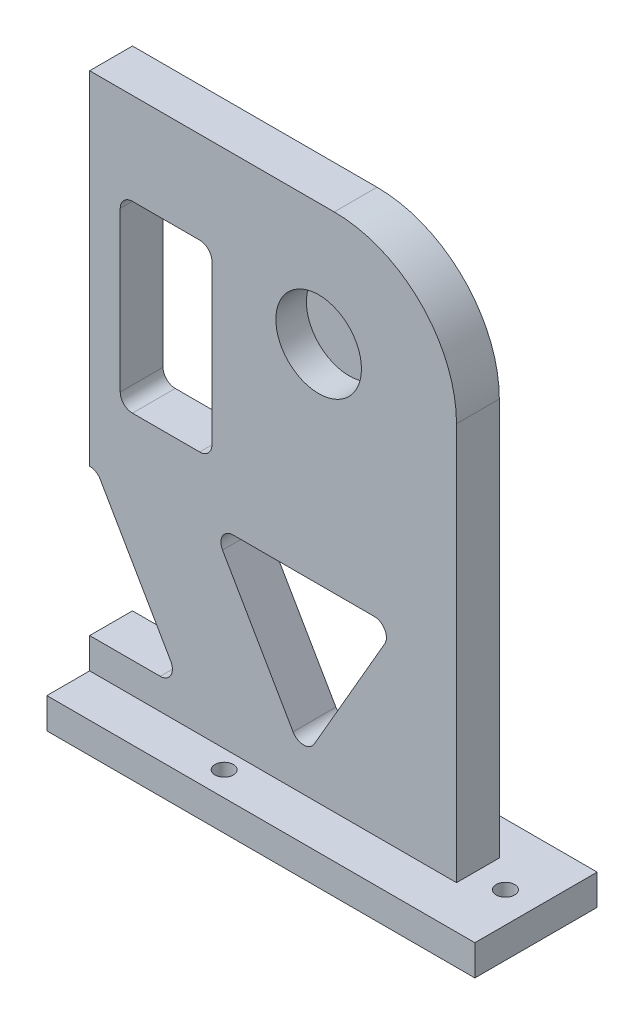
ISO-10303-21;
HEADER;
FILE_DESCRIPTION(('STEP AP214'),'2;1');
FILE_NAME('part.step','',(''),(''),'','','');
FILE_SCHEMA(('AUTOMOTIVE_DESIGN { 1 0 10303 214 1 1 1 1 }'));
ENDSEC;
DATA;
#1=APPLICATION_CONTEXT('core data for automotive mechanical design processes');
#2=APPLICATION_PROTOCOL_DEFINITION('international standard','automotive_design',2000,#1);
#3=PRODUCT_CONTEXT('',#1,'mechanical');
#4=PRODUCT('Part','Part','',(#3));
#5=PRODUCT_RELATED_PRODUCT_CATEGORY('part','',(#4));
#6=PRODUCT_DEFINITION_FORMATION('','',#4);
#7=PRODUCT_DEFINITION_CONTEXT('part definition',#1,'design');
#8=PRODUCT_DEFINITION('design','',#6,#7);
#9=PRODUCT_DEFINITION_SHAPE('','',#8);
#10=(LENGTH_UNIT() NAMED_UNIT(*) SI_UNIT(.MILLI.,.METRE.));
#11=(NAMED_UNIT(*) PLANE_ANGLE_UNIT() SI_UNIT($,.RADIAN.));
#12=(NAMED_UNIT(*) SI_UNIT($,.STERADIAN.) SOLID_ANGLE_UNIT());
#13=UNCERTAINTY_MEASURE_WITH_UNIT(LENGTH_MEASURE(1.E-05),#10,'distance_accuracy_value','');
#14=(GEOMETRIC_REPRESENTATION_CONTEXT(3) GLOBAL_UNCERTAINTY_ASSIGNED_CONTEXT((#13)) GLOBAL_UNIT_ASSIGNED_CONTEXT((#10,
#11,#12)) REPRESENTATION_CONTEXT('',''));
#15=CARTESIAN_POINT('',(0.,0.,0.));
#16=DIRECTION('',(0.,0.,1.));
#17=DIRECTION('',(1.,0.,0.));
#18=AXIS2_PLACEMENT_3D('',#15,#16,#17);
#19=CARTESIAN_POINT('',(70.,0.,0.));
#20=DIRECTION('',(1.,0.,0.));
#21=DIRECTION('',(0.,0.,-1.));
#22=AXIS2_PLACEMENT_3D('',#19,#20,#21);
#23=PLANE('',#22);
#24=DIRECTION('',(0.,1.,0.));
#25=VECTOR('',#24,1.);
#26=CARTESIAN_POINT('',(70.,5.,14.));
#27=LINE('',#26,#25);
#28=CARTESIAN_POINT('',(70.,0.,14.));
#29=VERTEX_POINT('',#28);
#30=CARTESIAN_POINT('',(70.,5.,14.));
#31=VERTEX_POINT('',#30);
#32=EDGE_CURVE('E48',#29,#31,#27,.T.);
#33=ORIENTED_EDGE('',*,*,#32,.T.);
#34=DIRECTION('',(0.,0.,1.));
#35=VECTOR('',#34,1.);
#36=CARTESIAN_POINT('',(70.,5.,0.));
#37=LINE('',#36,#35);
#38=CARTESIAN_POINT('',(70.,5.,7.));
#39=VERTEX_POINT('',#38);
#40=EDGE_CURVE('E396',#39,#31,#37,.T.);
#41=ORIENTED_EDGE('',*,*,#40,.F.);
#42=DIRECTION('',(0.,1.,0.));
#43=VECTOR('',#42,1.);
#44=CARTESIAN_POINT('',(70.,0.,7.));
#45=LINE('',#44,#43);
#46=CARTESIAN_POINT('',(70.,10.,7.));
#47=VERTEX_POINT('',#46);
#48=EDGE_CURVE('E389',#39,#47,#45,.T.);
#49=ORIENTED_EDGE('',*,*,#48,.T.);
#50=DIRECTION('',(0.,0.,1.));
#51=VECTOR('',#50,1.);
#52=CARTESIAN_POINT('',(70.,10.,-6.00100000000002));
#53=LINE('',#52,#51);
#54=CARTESIAN_POINT('',(70.,10.,0.));
#55=VERTEX_POINT('',#54);
#56=EDGE_CURVE('E386',#55,#47,#53,.T.);
#57=ORIENTED_EDGE('',*,*,#56,.F.);
#58=DIRECTION('',(0.,1.,0.));
#59=VECTOR('',#58,1.);
#60=CARTESIAN_POINT('',(70.,0.,0.));
#61=LINE('',#60,#59);
#62=CARTESIAN_POINT('',(70.,5.,0.));
#63=VERTEX_POINT('',#62);
#64=EDGE_CURVE('E387',#63,#55,#61,.T.);
#65=ORIENTED_EDGE('',*,*,#64,.F.);
#66=CARTESIAN_POINT('',(70.,5.,-6.00000000000002));
#67=VERTEX_POINT('',#66);
#68=EDGE_CURVE('E394',#67,#63,#37,.T.);
#69=ORIENTED_EDGE('',*,*,#68,.F.);
#70=DIRECTION('',(0.,-1.,0.));
#71=VECTOR('',#70,1.);
#72=CARTESIAN_POINT('',(70.,5.,-6.00000000000002));
#73=LINE('',#72,#71);
#74=CARTESIAN_POINT('',(70.,0.,-6.00000000000002));
#75=VERTEX_POINT('',#74);
#76=EDGE_CURVE('E11',#67,#75,#73,.T.);
#77=ORIENTED_EDGE('',*,*,#76,.T.);
#78=DIRECTION('',(0.,0.,-1.));
#79=VECTOR('',#78,1.);
#80=CARTESIAN_POINT('',(70.,0.,7.));
#81=LINE('',#80,#79);
#82=EDGE_CURVE('E43',#29,#75,#81,.T.);
#83=ORIENTED_EDGE('',*,*,#82,.F.);
#84=EDGE_LOOP('',(#33,#41,#49,#57,#65,#69,#77,#83));
#85=FACE_BOUND('',#84,.T.);
#86=ADVANCED_FACE('F40',(#85),#23,.F.);
#87=CARTESIAN_POINT('',(70.,33.9807621135332,0.));
#88=VERTEX_POINT('',#87);
#89=CARTESIAN_POINT('',(70.,90.,0.));
#90=VERTEX_POINT('',#89);
#91=EDGE_CURVE('E390',#88,#90,#61,.T.);
#92=ORIENTED_EDGE('',*,*,#91,.F.);
#93=DIRECTION('',(0.,0.,-1.));
#94=VECTOR('',#93,1.);
#95=CARTESIAN_POINT('',(70.,33.9807621135332,-6.00100000000002));
#96=LINE('',#95,#94);
#97=CARTESIAN_POINT('',(70.,33.9807621135332,7.));
#98=VERTEX_POINT('',#97);
#99=EDGE_CURVE('E384',#98,#88,#96,.T.);
#100=ORIENTED_EDGE('',*,*,#99,.F.);
#101=CARTESIAN_POINT('',(70.,90.,7.));
#102=VERTEX_POINT('',#101);
#103=EDGE_CURVE('E391',#98,#102,#45,.T.);
#104=ORIENTED_EDGE('',*,*,#103,.T.);
#105=DIRECTION('',(0.,0.,1.));
#106=VECTOR('',#105,1.);
#107=CARTESIAN_POINT('',(70.,90.,7.));
#108=LINE('',#107,#106);
#109=EDGE_CURVE('E56',#90,#102,#108,.T.);
#110=ORIENTED_EDGE('',*,*,#109,.F.);
#111=EDGE_LOOP('',(#92,#100,#104,#110));
#112=FACE_BOUND('',#111,.T.);
#113=ADVANCED_FACE('F527',(#112),#23,.F.);
#114=CARTESIAN_POINT('',(107.451775515975,69.9999999999981,2.));
#115=DIRECTION('',(0.,0.,1.));
#116=DIRECTION('',(1.,0.,0.));
#117=AXIS2_PLACEMENT_3D('',#114,#115,#116);
#118=PLANE('',#117);
#119=CARTESIAN_POINT('',(107.451775515975,69.9999999999981,2.));
#120=DIRECTION('',(0.,0.,1.));
#121=DIRECTION('',(1.,0.,0.));
#122=AXIS2_PLACEMENT_3D('',#119,#120,#121);
#123=CIRCLE('',#122,7.);
#124=CARTESIAN_POINT('',(114.451775515975,69.9999999999981,2.));
#125=VERTEX_POINT('',#124);
#126=EDGE_CURVE('E264',#125,#125,#123,.T.);
#127=ORIENTED_EDGE('',*,*,#126,.T.);
#128=EDGE_LOOP('',(#127));
#129=FACE_BOUND('',#128,.T.);
#130=ADVANCED_FACE('F517',(#129),#118,.T.);
#131=CARTESIAN_POINT('',(107.451775515975,69.9999999999981,2.));
#132=DIRECTION('',(0.,0.,1.));
#133=DIRECTION('',(1.,0.,0.));
#134=AXIS2_PLACEMENT_3D('',#131,#132,#133);
#135=CYLINDRICAL_SURFACE('',#134,7.);
#136=ORIENTED_EDGE('',*,*,#126,.F.);
#137=EDGE_LOOP('',(#136));
#138=FACE_BOUND('',#137,.T.);
#139=CARTESIAN_POINT('',(107.451775515975,69.9999999999981,7.));
#140=DIRECTION('',(0.,0.,1.));
#141=DIRECTION('',(1.,0.,0.));
#142=AXIS2_PLACEMENT_3D('',#139,#140,#141);
#143=CIRCLE('',#142,7.);
#144=CARTESIAN_POINT('',(114.451775515975,69.9999999999981,7.));
#145=VERTEX_POINT('',#144);
#146=EDGE_CURVE('E265',#145,#145,#143,.T.);
#147=ORIENTED_EDGE('',*,*,#146,.T.);
#148=EDGE_LOOP('',(#147));
#149=FACE_BOUND('',#148,.T.);
#150=ADVANCED_FACE('F514',(#138,#149),#135,.F.);
#151=CARTESIAN_POINT('',(116.535898384862,33.9807621135332,-6.00100000000002));
#152=DIRECTION('',(0.,0.,-1.));
#153=DIRECTION('',(-1.,0.,0.));
#154=AXIS2_PLACEMENT_3D('',#151,#152,#153);
#155=CYLINDRICAL_SURFACE('',#154,2.);
#156=CARTESIAN_POINT('',(116.535898384862,33.9807621135332,0.));
#157=DIRECTION('',(0.,0.,1.));
#158=DIRECTION('',(1.,0.,0.));
#159=AXIS2_PLACEMENT_3D('',#156,#157,#158);
#160=CIRCLE('',#159,2.);
#161=CARTESIAN_POINT('',(118.267949192431,32.9807621135332,0.));
#162=VERTEX_POINT('',#161);
#163=CARTESIAN_POINT('',(116.535898384862,35.9807621135332,0.));
#164=VERTEX_POINT('',#163);
#165=EDGE_CURVE('E320',#162,#164,#160,.T.);
#166=ORIENTED_EDGE('',*,*,#165,.F.);
#167=DIRECTION('',(0.,0.,1.));
#168=VECTOR('',#167,1.);
#169=CARTESIAN_POINT('',(118.267949192431,32.9807621135332,0.));
#170=LINE('',#169,#168);
#171=CARTESIAN_POINT('',(118.267949192431,32.9807621135332,7.));
#172=VERTEX_POINT('',#171);
#173=EDGE_CURVE('E305',#172,#162,#170,.F.);
#174=ORIENTED_EDGE('',*,*,#173,.F.);
#175=CARTESIAN_POINT('',(116.535898384862,33.9807621135332,7.));
#176=DIRECTION('',(0.,0.,1.));
#177=DIRECTION('',(1.,0.,0.));
#178=AXIS2_PLACEMENT_3D('',#175,#176,#177);
#179=CIRCLE('',#178,2.);
#180=CARTESIAN_POINT('',(116.535898384862,35.9807621135332,7.));
#181=VERTEX_POINT('',#180);
#182=EDGE_CURVE('E318',#181,#172,#179,.F.);
#183=ORIENTED_EDGE('',*,*,#182,.F.);
#184=DIRECTION('',(0.,0.,1.));
#185=VECTOR('',#184,1.);
#186=CARTESIAN_POINT('',(116.535898384862,35.9807621135332,7.));
#187=LINE('',#186,#185);
#188=EDGE_CURVE('E297',#164,#181,#187,.T.);
#189=ORIENTED_EDGE('',*,*,#188,.F.);
#190=EDGE_LOOP('',(#166,#174,#183,#189));
#191=FACE_BOUND('',#190,.T.);
#192=ADVANCED_FACE('F516',(#191),#155,.F.);
#193=CARTESIAN_POINT('',(120.,35.9807621135332,-6.00100000000002));
#194=DIRECTION('',(0.866025403784438,-0.5,0.));
#195=DIRECTION('',(0.5,0.866025403784439,0.));
#196=AXIS2_PLACEMENT_3D('',#193,#194,#195);
#197=PLANE('',#196);
#198=DIRECTION('',(0.5,0.866025403784439,0.));
#199=VECTOR('',#198,1.);
#200=CARTESIAN_POINT('',(120.,35.9807621135332,7.));
#201=LINE('',#200,#199);
#202=CARTESIAN_POINT('',(106.732050807569,13.,7.));
#203=VERTEX_POINT('',#202);
#204=EDGE_CURVE('E435',#203,#172,#201,.T.);
#205=ORIENTED_EDGE('',*,*,#204,.T.);
#206=ORIENTED_EDGE('',*,*,#173,.T.);
#207=DIRECTION('',(-0.5,-0.866025403784439,0.));
#208=VECTOR('',#207,1.);
#209=CARTESIAN_POINT('',(120.,35.9807621135332,0.));
#210=LINE('',#209,#208);
#211=CARTESIAN_POINT('',(106.732050807569,13.,0.));
#212=VERTEX_POINT('',#211);
#213=EDGE_CURVE('E441',#162,#212,#210,.T.);
#214=ORIENTED_EDGE('',*,*,#213,.T.);
#215=DIRECTION('',(0.,0.,1.));
#216=VECTOR('',#215,1.);
#217=CARTESIAN_POINT('',(106.732050807569,13.,7.));
#218=LINE('',#217,#216);
#219=EDGE_CURVE('E302',#212,#203,#218,.T.);
#220=ORIENTED_EDGE('',*,*,#219,.T.);
#221=EDGE_LOOP('',(#205,#206,#214,#220));
#222=FACE_BOUND('',#221,.T.);
#223=ADVANCED_FACE('F524',(#222),#197,.F.);
#224=CARTESIAN_POINT('',(105.,14.,-6.00100000000002));
#225=DIRECTION('',(0.,0.,-1.));
#226=DIRECTION('',(-1.,0.,0.));
#227=AXIS2_PLACEMENT_3D('',#224,#225,#226);
#228=CYLINDRICAL_SURFACE('',#227,2.);
#229=CARTESIAN_POINT('',(105.,14.,0.));
#230=DIRECTION('',(0.,0.,1.));
#231=DIRECTION('',(1.,0.,0.));
#232=AXIS2_PLACEMENT_3D('',#229,#230,#231);
#233=CIRCLE('',#232,2.);
#234=CARTESIAN_POINT('',(103.267949192431,13.,0.));
#235=VERTEX_POINT('',#234);
#236=EDGE_CURVE('E324',#235,#212,#233,.T.);
#237=ORIENTED_EDGE('',*,*,#236,.F.);
#238=DIRECTION('',(0.,0.,1.));
#239=VECTOR('',#238,1.);
#240=CARTESIAN_POINT('',(103.267949192431,13.,0.));
#241=LINE('',#240,#239);
#242=CARTESIAN_POINT('',(103.267949192431,13.,7.));
#243=VERTEX_POINT('',#242);
#244=EDGE_CURVE('E292',#243,#235,#241,.F.);
#245=ORIENTED_EDGE('',*,*,#244,.F.);
#246=CARTESIAN_POINT('',(105.,14.,7.));
#247=DIRECTION('',(0.,0.,1.));
#248=DIRECTION('',(1.,0.,0.));
#249=AXIS2_PLACEMENT_3D('',#246,#247,#248);
#250=CIRCLE('',#249,2.);
#251=EDGE_CURVE('E322',#203,#243,#250,.F.);
#252=ORIENTED_EDGE('',*,*,#251,.F.);
#253=ORIENTED_EDGE('',*,*,#219,.F.);
#254=EDGE_LOOP('',(#237,#245,#252,#253));
#255=FACE_BOUND('',#254,.T.);
#256=ADVANCED_FACE('F568',(#255),#228,.F.);
#257=CARTESIAN_POINT('',(105.,10.,-6.00100000000002));
#258=DIRECTION('',(-0.866025403784438,-0.5,0.));
#259=DIRECTION('',(0.5,-0.866025403784439,0.));
#260=AXIS2_PLACEMENT_3D('',#257,#258,#259);
#261=PLANE('',#260);
#262=DIRECTION('',(-0.5,0.866025403784439,0.));
#263=VECTOR('',#262,1.);
#264=CARTESIAN_POINT('',(105.,10.,0.));
#265=LINE('',#264,#263);
#266=CARTESIAN_POINT('',(91.7320508075689,32.9807621135332,0.));
#267=VERTEX_POINT('',#266);
#268=EDGE_CURVE('E429',#235,#267,#265,.T.);
#269=ORIENTED_EDGE('',*,*,#268,.T.);
#270=DIRECTION('',(0.,0.,1.));
#271=VECTOR('',#270,1.);
#272=CARTESIAN_POINT('',(91.7320508075689,32.9807621135332,7.));
#273=LINE('',#272,#271);
#274=CARTESIAN_POINT('',(91.7320508075689,32.9807621135332,7.));
#275=VERTEX_POINT('',#274);
#276=EDGE_CURVE('E294',#267,#275,#273,.T.);
#277=ORIENTED_EDGE('',*,*,#276,.T.);
#278=DIRECTION('',(0.5,-0.866025403784439,0.));
#279=VECTOR('',#278,1.);
#280=CARTESIAN_POINT('',(105.,10.,7.));
#281=LINE('',#280,#279);
#282=EDGE_CURVE('E432',#275,#243,#281,.T.);
#283=ORIENTED_EDGE('',*,*,#282,.T.);
#284=ORIENTED_EDGE('',*,*,#244,.T.);
#285=EDGE_LOOP('',(#269,#277,#283,#284));
#286=FACE_BOUND('',#285,.T.);
#287=ADVANCED_FACE('F565',(#286),#261,.F.);
#288=CARTESIAN_POINT('',(93.4641016151378,33.9807621135332,-6.00100000000002));
#289=DIRECTION('',(0.,0.,-1.));
#290=DIRECTION('',(-1.,0.,0.));
#291=AXIS2_PLACEMENT_3D('',#288,#289,#290);
#292=CYLINDRICAL_SURFACE('',#291,2.);
#293=CARTESIAN_POINT('',(93.4641016151378,33.9807621135332,0.));
#294=DIRECTION('',(0.,0.,1.));
#295=DIRECTION('',(1.,0.,0.));
#296=AXIS2_PLACEMENT_3D('',#293,#294,#295);
#297=CIRCLE('',#296,2.);
#298=CARTESIAN_POINT('',(93.4641016151378,35.9807621135332,0.));
#299=VERTEX_POINT('',#298);
#300=EDGE_CURVE('E316',#299,#267,#297,.T.);
#301=ORIENTED_EDGE('',*,*,#300,.F.);
#302=DIRECTION('',(0.,0.,1.));
#303=VECTOR('',#302,1.);
#304=CARTESIAN_POINT('',(93.4641016151378,35.9807621135332,0.));
#305=LINE('',#304,#303);
#306=CARTESIAN_POINT('',(93.4641016151378,35.9807621135332,7.));
#307=VERTEX_POINT('',#306);
#308=EDGE_CURVE('E300',#307,#299,#305,.F.);
#309=ORIENTED_EDGE('',*,*,#308,.F.);
#310=CARTESIAN_POINT('',(93.4641016151378,33.9807621135332,7.));
#311=DIRECTION('',(0.,0.,1.));
#312=DIRECTION('',(1.,0.,0.));
#313=AXIS2_PLACEMENT_3D('',#310,#311,#312);
#314=CIRCLE('',#313,2.);
#315=EDGE_CURVE('E314',#275,#307,#314,.F.);
#316=ORIENTED_EDGE('',*,*,#315,.F.);
#317=ORIENTED_EDGE('',*,*,#276,.F.);
#318=EDGE_LOOP('',(#301,#309,#316,#317));
#319=FACE_BOUND('',#318,.T.);
#320=ADVANCED_FACE('F562',(#319),#292,.F.);
#321=CARTESIAN_POINT('',(90.,35.9807621135332,-6.00100000000002));
#322=DIRECTION('',(0.,1.,0.));
#323=DIRECTION('',(0.,0.,1.));
#324=AXIS2_PLACEMENT_3D('',#321,#322,#323);
#325=PLANE('',#324);
#326=DIRECTION('',(-1.,0.,0.));
#327=VECTOR('',#326,1.);
#328=CARTESIAN_POINT('',(90.,35.9807621135332,7.));
#329=LINE('',#328,#327);
#330=EDGE_CURVE('E438',#181,#307,#329,.T.);
#331=ORIENTED_EDGE('',*,*,#330,.T.);
#332=ORIENTED_EDGE('',*,*,#308,.T.);
#333=DIRECTION('',(1.,0.,0.));
#334=VECTOR('',#333,1.);
#335=CARTESIAN_POINT('',(90.,35.9807621135332,0.));
#336=LINE('',#335,#334);
#337=EDGE_CURVE('E425',#299,#164,#336,.T.);
#338=ORIENTED_EDGE('',*,*,#337,.T.);
#339=ORIENTED_EDGE('',*,*,#188,.T.);
#340=EDGE_LOOP('',(#331,#332,#338,#339));
#341=FACE_BOUND('',#340,.T.);
#342=ADVANCED_FACE('F564',(#341),#325,.F.);
#343=CARTESIAN_POINT('',(88.,47.,-6.00000000000002));
#344=DIRECTION('',(0.,0.,-1.));
#345=DIRECTION('',(-1.,0.,0.));
#346=AXIS2_PLACEMENT_3D('',#343,#344,#345);
#347=CYLINDRICAL_SURFACE('',#346,2.);
#348=CARTESIAN_POINT('',(88.,47.,0.));
#349=DIRECTION('',(0.,0.,1.));
#350=DIRECTION('',(1.,0.,0.));
#351=AXIS2_PLACEMENT_3D('',#348,#349,#350);
#352=CIRCLE('',#351,2.);
#353=CARTESIAN_POINT('',(88.,45.,0.));
#354=VERTEX_POINT('',#353);
#355=CARTESIAN_POINT('',(90.,47.,0.));
#356=VERTEX_POINT('',#355);
#357=EDGE_CURVE('E374',#354,#356,#352,.T.);
#358=ORIENTED_EDGE('',*,*,#357,.F.);
#359=DIRECTION('',(0.,0.,1.));
#360=VECTOR('',#359,1.);
#361=CARTESIAN_POINT('',(88.,45.,0.));
#362=LINE('',#361,#360);
#363=CARTESIAN_POINT('',(88.,45.,7.));
#364=VERTEX_POINT('',#363);
#365=EDGE_CURVE('E348',#364,#354,#362,.F.);
#366=ORIENTED_EDGE('',*,*,#365,.F.);
#367=CARTESIAN_POINT('',(88.,47.,7.));
#368=DIRECTION('',(0.,0.,1.));
#369=DIRECTION('',(1.,0.,0.));
#370=AXIS2_PLACEMENT_3D('',#367,#368,#369);
#371=CIRCLE('',#370,2.);
#372=CARTESIAN_POINT('',(90.,47.,7.));
#373=VERTEX_POINT('',#372);
#374=EDGE_CURVE('E372',#373,#364,#371,.F.);
#375=ORIENTED_EDGE('',*,*,#374,.F.);
#376=DIRECTION('',(0.,0.,1.));
#377=VECTOR('',#376,1.);
#378=CARTESIAN_POINT('',(90.,47.,7.));
#379=LINE('',#378,#377);
#380=EDGE_CURVE('E360',#356,#373,#379,.T.);
#381=ORIENTED_EDGE('',*,*,#380,.F.);
#382=EDGE_LOOP('',(#358,#366,#375,#381));
#383=FACE_BOUND('',#382,.T.);
#384=ADVANCED_FACE('F485',(#383),#347,.F.);
#385=CARTESIAN_POINT('',(75.,45.,-6.00000000000002));
#386=DIRECTION('',(0.,-1.,0.));
#387=DIRECTION('',(0.,0.,-1.));
#388=AXIS2_PLACEMENT_3D('',#385,#386,#387);
#389=PLANE('',#388);
#390=DIRECTION('',(1.,0.,0.));
#391=VECTOR('',#390,1.);
#392=CARTESIAN_POINT('',(0.,45.,0.));
#393=LINE('',#392,#391);
#394=CARTESIAN_POINT('',(77.,45.,0.));
#395=VERTEX_POINT('',#394);
#396=EDGE_CURVE('E336',#395,#354,#393,.T.);
#397=ORIENTED_EDGE('',*,*,#396,.F.);
#398=DIRECTION('',(0.,0.,1.));
#399=VECTOR('',#398,1.);
#400=CARTESIAN_POINT('',(77.,45.,7.));
#401=LINE('',#400,#399);
#402=CARTESIAN_POINT('',(77.,45.,7.));
#403=VERTEX_POINT('',#402);
#404=EDGE_CURVE('E350',#395,#403,#401,.T.);
#405=ORIENTED_EDGE('',*,*,#404,.T.);
#406=DIRECTION('',(1.,0.,0.));
#407=VECTOR('',#406,1.);
#408=CARTESIAN_POINT('',(75.,45.,7.));
#409=LINE('',#408,#407);
#410=EDGE_CURVE('E459',#403,#364,#409,.T.);
#411=ORIENTED_EDGE('',*,*,#410,.T.);
#412=ORIENTED_EDGE('',*,*,#365,.T.);
#413=EDGE_LOOP('',(#397,#405,#411,#412));
#414=FACE_BOUND('',#413,.T.);
#415=ADVANCED_FACE('F481',(#414),#389,.F.);
#416=CARTESIAN_POINT('',(77.,47.,-6.00000000000002));
#417=DIRECTION('',(0.,0.,-1.));
#418=DIRECTION('',(-1.,0.,0.));
#419=AXIS2_PLACEMENT_3D('',#416,#417,#418);
#420=CYLINDRICAL_SURFACE('',#419,2.);
#421=CARTESIAN_POINT('',(77.,47.,0.));
#422=DIRECTION('',(0.,0.,1.));
#423=DIRECTION('',(1.,0.,0.));
#424=AXIS2_PLACEMENT_3D('',#421,#422,#423);
#425=CIRCLE('',#424,2.);
#426=CARTESIAN_POINT('',(75.,47.,0.));
#427=VERTEX_POINT('',#426);
#428=EDGE_CURVE('E370',#427,#395,#425,.T.);
#429=ORIENTED_EDGE('',*,*,#428,.F.);
#430=DIRECTION('',(0.,0.,1.));
#431=VECTOR('',#430,1.);
#432=CARTESIAN_POINT('',(75.,47.,0.));
#433=LINE('',#432,#431);
#434=CARTESIAN_POINT('',(75.,47.,7.));
#435=VERTEX_POINT('',#434);
#436=EDGE_CURVE('E356',#435,#427,#433,.F.);
#437=ORIENTED_EDGE('',*,*,#436,.F.);
#438=CARTESIAN_POINT('',(77.,47.,7.));
#439=DIRECTION('',(0.,0.,1.));
#440=DIRECTION('',(1.,0.,0.));
#441=AXIS2_PLACEMENT_3D('',#438,#439,#440);
#442=CIRCLE('',#441,2.);
#443=EDGE_CURVE('E368',#403,#435,#442,.F.);
#444=ORIENTED_EDGE('',*,*,#443,.F.);
#445=ORIENTED_EDGE('',*,*,#404,.F.);
#446=EDGE_LOOP('',(#429,#437,#444,#445));
#447=FACE_BOUND('',#446,.T.);
#448=ADVANCED_FACE('F473',(#447),#420,.F.);
#449=CARTESIAN_POINT('',(75.,45.,-6.00000000000002));
#450=DIRECTION('',(-1.,0.,0.));
#451=DIRECTION('',(0.,0.,1.));
#452=AXIS2_PLACEMENT_3D('',#449,#450,#451);
#453=PLANE('',#452);
#454=DIRECTION('',(0.,-1.,0.));
#455=VECTOR('',#454,1.);
#456=CARTESIAN_POINT('',(75.,45.,7.));
#457=LINE('',#456,#455);
#458=CARTESIAN_POINT('',(75.,73.,7.));
#459=VERTEX_POINT('',#458);
#460=EDGE_CURVE('E462',#459,#435,#457,.T.);
#461=ORIENTED_EDGE('',*,*,#460,.T.);
#462=ORIENTED_EDGE('',*,*,#436,.T.);
#463=DIRECTION('',(0.,-1.,0.));
#464=VECTOR('',#463,1.);
#465=CARTESIAN_POINT('',(75.,0.,0.));
#466=LINE('',#465,#464);
#467=CARTESIAN_POINT('',(75.,73.,0.));
#468=VERTEX_POINT('',#467);
#469=EDGE_CURVE('E345',#468,#427,#466,.T.);
#470=ORIENTED_EDGE('',*,*,#469,.F.);
#471=DIRECTION('',(0.,0.,1.));
#472=VECTOR('',#471,1.);
#473=CARTESIAN_POINT('',(75.,73.,7.));
#474=LINE('',#473,#472);
#475=EDGE_CURVE('E353',#468,#459,#474,.T.);
#476=ORIENTED_EDGE('',*,*,#475,.T.);
#477=EDGE_LOOP('',(#461,#462,#470,#476));
#478=FACE_BOUND('',#477,.T.);
#479=ADVANCED_FACE('F467',(#478),#453,.F.);
#480=CARTESIAN_POINT('',(77.,73.,-6.00000000000002));
#481=DIRECTION('',(0.,0.,-1.));
#482=DIRECTION('',(-1.,0.,0.));
#483=AXIS2_PLACEMENT_3D('',#480,#481,#482);
#484=CYLINDRICAL_SURFACE('',#483,2.);
#485=CARTESIAN_POINT('',(77.,73.,0.));
#486=DIRECTION('',(0.,0.,1.));
#487=DIRECTION('',(1.,0.,0.));
#488=AXIS2_PLACEMENT_3D('',#485,#486,#487);
#489=CIRCLE('',#488,2.);
#490=CARTESIAN_POINT('',(77.,75.,0.));
#491=VERTEX_POINT('',#490);
#492=EDGE_CURVE('E378',#491,#468,#489,.T.);
#493=ORIENTED_EDGE('',*,*,#492,.F.);
#494=DIRECTION('',(0.,0.,1.));
#495=VECTOR('',#494,1.);
#496=CARTESIAN_POINT('',(77.,75.,0.));
#497=LINE('',#496,#495);
#498=CARTESIAN_POINT('',(77.,75.,7.));
#499=VERTEX_POINT('',#498);
#500=EDGE_CURVE('E366',#499,#491,#497,.F.);
#501=ORIENTED_EDGE('',*,*,#500,.F.);
#502=CARTESIAN_POINT('',(77.,73.,7.));
#503=DIRECTION('',(0.,0.,1.));
#504=DIRECTION('',(1.,0.,0.));
#505=AXIS2_PLACEMENT_3D('',#502,#503,#504);
#506=CIRCLE('',#505,2.);
#507=EDGE_CURVE('E376',#459,#499,#506,.F.);
#508=ORIENTED_EDGE('',*,*,#507,.F.);
#509=ORIENTED_EDGE('',*,*,#475,.F.);
#510=EDGE_LOOP('',(#493,#501,#508,#509));
#511=FACE_BOUND('',#510,.T.);
#512=ADVANCED_FACE('F503',(#511),#484,.F.);
#513=CARTESIAN_POINT('',(75.,75.,-6.00000000000002));
#514=DIRECTION('',(0.,1.,0.));
#515=DIRECTION('',(0.,0.,1.));
#516=AXIS2_PLACEMENT_3D('',#513,#514,#515);
#517=PLANE('',#516);
#518=DIRECTION('',(-1.,0.,0.));
#519=VECTOR('',#518,1.);
#520=CARTESIAN_POINT('',(75.,75.,7.));
#521=LINE('',#520,#519);
#522=CARTESIAN_POINT('',(88.,75.,7.));
#523=VERTEX_POINT('',#522);
#524=EDGE_CURVE('E444',#523,#499,#521,.T.);
#525=ORIENTED_EDGE('',*,*,#524,.T.);
#526=ORIENTED_EDGE('',*,*,#500,.T.);
#527=DIRECTION('',(-1.,0.,0.));
#528=VECTOR('',#527,1.);
#529=CARTESIAN_POINT('',(0.,75.,0.));
#530=LINE('',#529,#528);
#531=CARTESIAN_POINT('',(88.,75.,0.));
#532=VERTEX_POINT('',#531);
#533=EDGE_CURVE('E342',#532,#491,#530,.T.);
#534=ORIENTED_EDGE('',*,*,#533,.F.);
#535=DIRECTION('',(0.,0.,1.));
#536=VECTOR('',#535,1.);
#537=CARTESIAN_POINT('',(88.,75.,7.));
#538=LINE('',#537,#536);
#539=EDGE_CURVE('E363',#532,#523,#538,.T.);
#540=ORIENTED_EDGE('',*,*,#539,.T.);
#541=EDGE_LOOP('',(#525,#526,#534,#540));
#542=FACE_BOUND('',#541,.T.);
#543=ADVANCED_FACE('F499',(#542),#517,.F.);
#544=CARTESIAN_POINT('',(88.,73.,-6.00000000000002));
#545=DIRECTION('',(0.,0.,-1.));
#546=DIRECTION('',(-1.,0.,0.));
#547=AXIS2_PLACEMENT_3D('',#544,#545,#546);
#548=CYLINDRICAL_SURFACE('',#547,2.);
#549=CARTESIAN_POINT('',(88.,73.,0.));
#550=DIRECTION('',(0.,0.,1.));
#551=DIRECTION('',(1.,0.,0.));
#552=AXIS2_PLACEMENT_3D('',#549,#550,#551);
#553=CIRCLE('',#552,2.);
#554=CARTESIAN_POINT('',(90.,73.,0.));
#555=VERTEX_POINT('',#554);
#556=EDGE_CURVE('E382',#555,#532,#553,.T.);
#557=ORIENTED_EDGE('',*,*,#556,.F.);
#558=DIRECTION('',(0.,0.,1.));
#559=VECTOR('',#558,1.);
#560=CARTESIAN_POINT('',(90.,73.,0.));
#561=LINE('',#560,#559);
#562=CARTESIAN_POINT('',(90.,73.,7.));
#563=VERTEX_POINT('',#562);
#564=EDGE_CURVE('E358',#563,#555,#561,.F.);
#565=ORIENTED_EDGE('',*,*,#564,.F.);
#566=CARTESIAN_POINT('',(88.,73.,7.));
#567=DIRECTION('',(0.,0.,1.));
#568=DIRECTION('',(1.,0.,0.));
#569=AXIS2_PLACEMENT_3D('',#566,#567,#568);
#570=CIRCLE('',#569,2.);
#571=EDGE_CURVE('E380',#523,#563,#570,.F.);
#572=ORIENTED_EDGE('',*,*,#571,.F.);
#573=ORIENTED_EDGE('',*,*,#539,.F.);
#574=EDGE_LOOP('',(#557,#565,#572,#573));
#575=FACE_BOUND('',#574,.T.);
#576=ADVANCED_FACE('F494',(#575),#548,.F.);
#577=CARTESIAN_POINT('',(90.,45.,-6.00000000000002));
#578=DIRECTION('',(1.,0.,0.));
#579=DIRECTION('',(0.,0.,-1.));
#580=AXIS2_PLACEMENT_3D('',#577,#578,#579);
#581=PLANE('',#580);
#582=DIRECTION('',(0.,1.,0.));
#583=VECTOR('',#582,1.);
#584=CARTESIAN_POINT('',(90.,0.,0.));
#585=LINE('',#584,#583);
#586=EDGE_CURVE('E339',#356,#555,#585,.T.);
#587=ORIENTED_EDGE('',*,*,#586,.F.);
#588=ORIENTED_EDGE('',*,*,#380,.T.);
#589=DIRECTION('',(0.,1.,0.));
#590=VECTOR('',#589,1.);
#591=CARTESIAN_POINT('',(90.,45.,7.));
#592=LINE('',#591,#590);
#593=EDGE_CURVE('E456',#373,#563,#592,.T.);
#594=ORIENTED_EDGE('',*,*,#593,.T.);
#595=ORIENTED_EDGE('',*,*,#564,.T.);
#596=EDGE_LOOP('',(#587,#588,#594,#595));
#597=FACE_BOUND('',#596,.T.);
#598=ADVANCED_FACE('F490',(#597),#581,.F.);
#599=CARTESIAN_POINT('',(110.,70.,7.));
#600=DIRECTION('',(0.,0.,-1.));
#601=DIRECTION('',(-1.,0.,0.));
#602=AXIS2_PLACEMENT_3D('',#599,#600,#601);
#603=CYLINDRICAL_SURFACE('',#602,20.);
#604=CARTESIAN_POINT('',(110.,70.,7.));
#605=DIRECTION('',(0.,0.,1.));
#606=DIRECTION('',(1.,0.,0.));
#607=AXIS2_PLACEMENT_3D('',#604,#605,#606);
#608=CIRCLE('',#607,20.);
#609=CARTESIAN_POINT('',(130.,70.,7.));
#610=VERTEX_POINT('',#609);
#611=CARTESIAN_POINT('',(110.,90.,7.));
#612=VERTEX_POINT('',#611);
#613=EDGE_CURVE('E288',#610,#612,#608,.T.);
#614=ORIENTED_EDGE('',*,*,#613,.F.);
#615=DIRECTION('',(0.,0.,-1.));
#616=VECTOR('',#615,1.);
#617=CARTESIAN_POINT('',(130.,70.,7.));
#618=LINE('',#617,#616);
#619=CARTESIAN_POINT('',(130.,70.,0.));
#620=VERTEX_POINT('',#619);
#621=EDGE_CURVE('E285',#620,#610,#618,.F.);
#622=ORIENTED_EDGE('',*,*,#621,.F.);
#623=CARTESIAN_POINT('',(110.,70.,0.));
#624=DIRECTION('',(0.,0.,1.));
#625=DIRECTION('',(1.,0.,0.));
#626=AXIS2_PLACEMENT_3D('',#623,#624,#625);
#627=CIRCLE('',#626,20.);
#628=CARTESIAN_POINT('',(110.,90.,0.));
#629=VERTEX_POINT('',#628);
#630=EDGE_CURVE('E282',#629,#620,#627,.F.);
#631=ORIENTED_EDGE('',*,*,#630,.F.);
#632=DIRECTION('',(0.,0.,-1.));
#633=VECTOR('',#632,1.);
#634=CARTESIAN_POINT('',(110.,90.,7.));
#635=LINE('',#634,#633);
#636=EDGE_CURVE('E277',#612,#629,#635,.T.);
#637=ORIENTED_EDGE('',*,*,#636,.F.);
#638=EDGE_LOOP('',(#614,#622,#631,#637));
#639=FACE_BOUND('',#638,.T.);
#640=ADVANCED_FACE('F553',(#639),#603,.T.);
#641=CARTESIAN_POINT('',(130.,90.,7.));
#642=DIRECTION('',(-1.,0.,0.));
#643=DIRECTION('',(0.,0.,1.));
#644=AXIS2_PLACEMENT_3D('',#641,#642,#643);
#645=PLANE('',#644);
#646=DIRECTION('',(0.,0.,1.));
#647=VECTOR('',#646,1.);
#648=CARTESIAN_POINT('',(130.,5.,7.));
#649=LINE('',#648,#647);
#650=CARTESIAN_POINT('',(130.,5.,0.));
#651=VERTEX_POINT('',#650);
#652=CARTESIAN_POINT('',(130.,5.00000000000003,7.));
#653=VERTEX_POINT('',#652);
#654=EDGE_CURVE('E258',#651,#653,#649,.T.);
#655=ORIENTED_EDGE('',*,*,#654,.F.);
#656=DIRECTION('',(0.,1.,0.));
#657=VECTOR('',#656,1.);
#658=CARTESIAN_POINT('',(130.,90.,0.));
#659=LINE('',#658,#657);
#660=EDGE_CURVE('E268',#651,#620,#659,.T.);
#661=ORIENTED_EDGE('',*,*,#660,.T.);
#662=ORIENTED_EDGE('',*,*,#621,.T.);
#663=DIRECTION('',(0.,1.,0.));
#664=VECTOR('',#663,1.);
#665=CARTESIAN_POINT('',(130.,90.,7.));
#666=LINE('',#665,#664);
#667=EDGE_CURVE('E271',#653,#610,#666,.T.);
#668=ORIENTED_EDGE('',*,*,#667,.F.);
#669=EDGE_LOOP('',(#655,#661,#662,#668));
#670=FACE_BOUND('',#669,.T.);
#671=ADVANCED_FACE('F549',(#670),#645,.F.);
#672=CARTESIAN_POINT('',(81.5358983848623,12.,-6.00100000000002));
#673=DIRECTION('',(0.,0.,-1.));
#674=DIRECTION('',(-1.,0.,0.));
#675=AXIS2_PLACEMENT_3D('',#672,#673,#674);
#676=CYLINDRICAL_SURFACE('',#675,2.);
#677=CARTESIAN_POINT('',(81.5358983848623,12.,0.));
#678=DIRECTION('',(0.,0.,1.));
#679=DIRECTION('',(1.,0.,0.));
#680=AXIS2_PLACEMENT_3D('',#677,#678,#679);
#681=CIRCLE('',#680,2.);
#682=CARTESIAN_POINT('',(81.5358983848623,10.,0.));
#683=VERTEX_POINT('',#682);
#684=CARTESIAN_POINT('',(83.2679491924311,13.,0.));
#685=VERTEX_POINT('',#684);
#686=EDGE_CURVE('E334',#683,#685,#681,.T.);
#687=ORIENTED_EDGE('',*,*,#686,.F.);
#688=DIRECTION('',(0.,0.,1.));
#689=VECTOR('',#688,1.);
#690=CARTESIAN_POINT('',(81.5358983848623,10.,0.));
#691=LINE('',#690,#689);
#692=CARTESIAN_POINT('',(81.5358983848623,10.,7.));
#693=VERTEX_POINT('',#692);
#694=EDGE_CURVE('E312',#693,#683,#691,.F.);
#695=ORIENTED_EDGE('',*,*,#694,.F.);
#696=CARTESIAN_POINT('',(81.5358983848623,12.,7.));
#697=DIRECTION('',(0.,0.,1.));
#698=DIRECTION('',(1.,0.,0.));
#699=AXIS2_PLACEMENT_3D('',#696,#697,#698);
#700=CIRCLE('',#699,2.);
#701=CARTESIAN_POINT('',(83.2679491924311,13.,7.));
#702=VERTEX_POINT('',#701);
#703=EDGE_CURVE('E331',#702,#693,#700,.F.);
#704=ORIENTED_EDGE('',*,*,#703,.F.);
#705=DIRECTION('',(0.,0.,1.));
#706=VECTOR('',#705,1.);
#707=CARTESIAN_POINT('',(83.2679491924311,13.,7.));
#708=LINE('',#707,#706);
#709=EDGE_CURVE('E307',#685,#702,#708,.T.);
#710=ORIENTED_EDGE('',*,*,#709,.F.);
#711=EDGE_LOOP('',(#687,#695,#704,#710));
#712=FACE_BOUND('',#711,.T.);
#713=ADVANCED_FACE('F552',(#712),#676,.F.);
#714=CARTESIAN_POINT('',(85.,10.,-6.00100000000002));
#715=DIRECTION('',(0.866025403784439,0.5,0.));
#716=DIRECTION('',(-0.5,0.866025403784439,0.));
#717=AXIS2_PLACEMENT_3D('',#714,#715,#716);
#718=PLANE('',#717);
#719=DIRECTION('',(-0.5,0.866025403784438,0.));
#720=VECTOR('',#719,1.);
#721=CARTESIAN_POINT('',(85.,10.,7.));
#722=LINE('',#721,#720);
#723=CARTESIAN_POINT('',(71.7320508075689,32.9807621135332,7.));
#724=VERTEX_POINT('',#723);
#725=EDGE_CURVE('E449',#702,#724,#722,.T.);
#726=ORIENTED_EDGE('',*,*,#725,.T.);
#727=DIRECTION('',(0.,0.,1.));
#728=VECTOR('',#727,1.);
#729=CARTESIAN_POINT('',(71.7320508075689,32.9807621135332,0.));
#730=LINE('',#729,#728);
#731=CARTESIAN_POINT('',(71.7320508075689,32.9807621135332,0.));
#732=VERTEX_POINT('',#731);
#733=EDGE_CURVE('E310',#724,#732,#730,.F.);
#734=ORIENTED_EDGE('',*,*,#733,.T.);
#735=DIRECTION('',(0.5,-0.866025403784439,0.));
#736=VECTOR('',#735,1.);
#737=CARTESIAN_POINT('',(85.,10.,0.));
#738=LINE('',#737,#736);
#739=EDGE_CURVE('E422',#732,#685,#738,.T.);
#740=ORIENTED_EDGE('',*,*,#739,.T.);
#741=ORIENTED_EDGE('',*,*,#709,.T.);
#742=EDGE_LOOP('',(#726,#734,#740,#741));
#743=FACE_BOUND('',#742,.T.);
#744=ADVANCED_FACE('F578',(#743),#718,.F.);
#745=CARTESIAN_POINT('',(0.,0.,0.));
#746=DIRECTION('',(0.,0.,1.));
#747=DIRECTION('',(1.,0.,0.));
#748=AXIS2_PLACEMENT_3D('',#745,#746,#747);
#749=PLANE('',#748);
#750=ORIENTED_EDGE('',*,*,#586,.T.);
#751=ORIENTED_EDGE('',*,*,#556,.T.);
#752=ORIENTED_EDGE('',*,*,#533,.T.);
#753=ORIENTED_EDGE('',*,*,#492,.T.);
#754=ORIENTED_EDGE('',*,*,#469,.T.);
#755=ORIENTED_EDGE('',*,*,#428,.T.);
#756=ORIENTED_EDGE('',*,*,#396,.T.);
#757=ORIENTED_EDGE('',*,*,#357,.T.);
#758=EDGE_LOOP('',(#750,#751,#752,#753,#754,#755,#756,#757));
#759=FACE_BOUND('',#758,.T.);
#760=DIRECTION('',(1.,0.,0.));
#761=VECTOR('',#760,1.);
#762=CARTESIAN_POINT('',(0.,5.,0.));
#763=LINE('',#762,#761);
#764=EDGE_CURVE('E290',#63,#651,#763,.T.);
#765=ORIENTED_EDGE('',*,*,#764,.F.);
#766=ORIENTED_EDGE('',*,*,#64,.T.);
#767=DIRECTION('',(-1.,0.,0.));
#768=VECTOR('',#767,1.);
#769=CARTESIAN_POINT('',(55.,10.,0.));
#770=LINE('',#769,#768);
#771=EDGE_CURVE('E428',#683,#55,#770,.T.);
#772=ORIENTED_EDGE('',*,*,#771,.F.);
#773=ORIENTED_EDGE('',*,*,#686,.T.);
#774=ORIENTED_EDGE('',*,*,#739,.F.);
#775=CARTESIAN_POINT('',(70.,31.9807621135332,0.));
#776=DIRECTION('',(0.,0.,1.));
#777=DIRECTION('',(1.,0.,0.));
#778=AXIS2_PLACEMENT_3D('',#775,#776,#777);
#779=CIRCLE('',#778,2.);
#780=EDGE_CURVE('E328',#732,#88,#779,.T.);
#781=ORIENTED_EDGE('',*,*,#780,.T.);
#782=ORIENTED_EDGE('',*,*,#91,.T.);
#783=DIRECTION('',(-1.,0.,0.));
#784=VECTOR('',#783,1.);
#785=CARTESIAN_POINT('',(130.,90.,0.));
#786=LINE('',#785,#784);
#787=EDGE_CURVE('E274',#629,#90,#786,.T.);
#788=ORIENTED_EDGE('',*,*,#787,.F.);
#789=ORIENTED_EDGE('',*,*,#630,.T.);
#790=ORIENTED_EDGE('',*,*,#660,.F.);
#791=EDGE_LOOP('',(#765,#766,#772,#773,#774,#781,#782,#788,#789,#790));
#792=FACE_BOUND('',#791,.T.);
#793=ORIENTED_EDGE('',*,*,#337,.F.);
#794=ORIENTED_EDGE('',*,*,#300,.T.);
#795=ORIENTED_EDGE('',*,*,#268,.F.);
#796=ORIENTED_EDGE('',*,*,#236,.T.);
#797=ORIENTED_EDGE('',*,*,#213,.F.);
#798=ORIENTED_EDGE('',*,*,#165,.T.);
#799=EDGE_LOOP('',(#793,#794,#795,#796,#797,#798));
#800=FACE_BOUND('',#799,.T.);
#801=ADVANCED_FACE('F477',(#759,#792,#800),#749,.F.);
#802=CARTESIAN_POINT('',(0.,0.,7.));
#803=DIRECTION('',(0.,0.,1.));
#804=DIRECTION('',(1.,0.,0.));
#805=AXIS2_PLACEMENT_3D('',#802,#803,#804);
#806=PLANE('',#805);
#807=ORIENTED_EDGE('',*,*,#48,.F.);
#808=DIRECTION('',(1.,0.,0.));
#809=VECTOR('',#808,1.);
#810=CARTESIAN_POINT('',(0.,5.,7.));
#811=LINE('',#810,#809);
#812=EDGE_CURVE('E262',#39,#653,#811,.T.);
#813=ORIENTED_EDGE('',*,*,#812,.T.);
#814=ORIENTED_EDGE('',*,*,#667,.T.);
#815=ORIENTED_EDGE('',*,*,#613,.T.);
#816=DIRECTION('',(-1.,0.,0.));
#817=VECTOR('',#816,1.);
#818=CARTESIAN_POINT('',(130.,90.,7.));
#819=LINE('',#818,#817);
#820=EDGE_CURVE('E273',#612,#102,#819,.T.);
#821=ORIENTED_EDGE('',*,*,#820,.T.);
#822=ORIENTED_EDGE('',*,*,#103,.F.);
#823=CARTESIAN_POINT('',(70.,31.9807621135332,7.));
#824=DIRECTION('',(0.,0.,1.));
#825=DIRECTION('',(1.,0.,0.));
#826=AXIS2_PLACEMENT_3D('',#823,#824,#825);
#827=CIRCLE('',#826,2.);
#828=EDGE_CURVE('E326',#98,#724,#827,.F.);
#829=ORIENTED_EDGE('',*,*,#828,.T.);
#830=ORIENTED_EDGE('',*,*,#725,.F.);
#831=ORIENTED_EDGE('',*,*,#703,.T.);
#832=DIRECTION('',(1.,0.,0.));
#833=VECTOR('',#832,1.);
#834=CARTESIAN_POINT('',(55.,10.,7.));
#835=LINE('',#834,#833);
#836=EDGE_CURVE('E447',#47,#693,#835,.T.);
#837=ORIENTED_EDGE('',*,*,#836,.F.);
#838=EDGE_LOOP('',(#807,#813,#814,#815,#821,#822,#829,#830,#831,#837));
#839=FACE_BOUND('',#838,.T.);
#840=ORIENTED_EDGE('',*,*,#460,.F.);
#841=ORIENTED_EDGE('',*,*,#507,.T.);
#842=ORIENTED_EDGE('',*,*,#524,.F.);
#843=ORIENTED_EDGE('',*,*,#571,.T.);
#844=ORIENTED_EDGE('',*,*,#593,.F.);
#845=ORIENTED_EDGE('',*,*,#374,.T.);
#846=ORIENTED_EDGE('',*,*,#410,.F.);
#847=ORIENTED_EDGE('',*,*,#443,.T.);
#848=EDGE_LOOP('',(#840,#841,#842,#843,#844,#845,#846,#847));
#849=FACE_BOUND('',#848,.T.);
#850=ORIENTED_EDGE('',*,*,#282,.F.);
#851=ORIENTED_EDGE('',*,*,#315,.T.);
#852=ORIENTED_EDGE('',*,*,#330,.F.);
#853=ORIENTED_EDGE('',*,*,#182,.T.);
#854=ORIENTED_EDGE('',*,*,#204,.F.);
#855=ORIENTED_EDGE('',*,*,#251,.T.);
#856=EDGE_LOOP('',(#850,#851,#852,#853,#854,#855));
#857=FACE_BOUND('',#856,.T.);
#858=ORIENTED_EDGE('',*,*,#146,.F.);
#859=EDGE_LOOP('',(#858));
#860=FACE_BOUND('',#859,.T.);
#861=ADVANCED_FACE('F504',(#839,#849,#857,#860),#806,.T.);
#862=CARTESIAN_POINT('',(70.,31.9807621135332,-6.00100000000002));
#863=DIRECTION('',(0.,0.,-1.));
#864=DIRECTION('',(-1.,0.,0.));
#865=AXIS2_PLACEMENT_3D('',#862,#863,#864);
#866=CYLINDRICAL_SURFACE('',#865,2.);
#867=ORIENTED_EDGE('',*,*,#828,.F.);
#868=ORIENTED_EDGE('',*,*,#99,.T.);
#869=ORIENTED_EDGE('',*,*,#780,.F.);
#870=ORIENTED_EDGE('',*,*,#733,.F.);
#871=EDGE_LOOP('',(#867,#868,#869,#870));
#872=FACE_BOUND('',#871,.T.);
#873=ADVANCED_FACE('F507',(#872),#866,.F.);
#874=CARTESIAN_POINT('',(55.,10.,-6.00100000000002));
#875=DIRECTION('',(0.,-1.,0.));
#876=DIRECTION('',(0.,0.,-1.));
#877=AXIS2_PLACEMENT_3D('',#874,#875,#876);
#878=PLANE('',#877);
#879=ORIENTED_EDGE('',*,*,#771,.T.);
#880=ORIENTED_EDGE('',*,*,#56,.T.);
#881=ORIENTED_EDGE('',*,*,#836,.T.);
#882=ORIENTED_EDGE('',*,*,#694,.T.);
#883=EDGE_LOOP('',(#879,#880,#881,#882));
#884=FACE_BOUND('',#883,.T.);
#885=ADVANCED_FACE('F574',(#884),#878,.F.);
#886=CARTESIAN_POINT('',(140.,5.,-6.00000000000002));
#887=DIRECTION('',(1.,0.,0.));
#888=DIRECTION('',(0.,1.,0.));
#889=AXIS2_PLACEMENT_3D('',#886,#887,#888);
#890=PLANE('',#889);
#891=DIRECTION('',(0.,0.,1.));
#892=VECTOR('',#891,1.);
#893=CARTESIAN_POINT('',(140.,0.,-6.00000000000002));
#894=LINE('',#893,#892);
#895=CARTESIAN_POINT('',(140.,0.,-6.00000000000002));
#896=VERTEX_POINT('',#895);
#897=CARTESIAN_POINT('',(140.,0.,14.));
#898=VERTEX_POINT('',#897);
#899=EDGE_CURVE('E242',#896,#898,#894,.T.);
#900=ORIENTED_EDGE('',*,*,#899,.F.);
#901=DIRECTION('',(0.,-1.,0.));
#902=VECTOR('',#901,1.);
#903=CARTESIAN_POINT('',(140.,5.,-6.00000000000002));
#904=LINE('',#903,#902);
#905=CARTESIAN_POINT('',(140.,5.,-6.00000000000002));
#906=VERTEX_POINT('',#905);
#907=EDGE_CURVE('E230',#906,#896,#904,.T.);
#908=ORIENTED_EDGE('',*,*,#907,.F.);
#909=DIRECTION('',(0.,0.,1.));
#910=VECTOR('',#909,1.);
#911=CARTESIAN_POINT('',(140.,5.,-6.00000000000002));
#912=LINE('',#911,#910);
#913=CARTESIAN_POINT('',(140.,5.,14.));
#914=VERTEX_POINT('',#913);
#915=EDGE_CURVE('E235',#906,#914,#912,.T.);
#916=ORIENTED_EDGE('',*,*,#915,.T.);
#917=DIRECTION('',(0.,-1.,0.));
#918=VECTOR('',#917,1.);
#919=CARTESIAN_POINT('',(140.,5.,14.));
#920=LINE('',#919,#918);
#921=EDGE_CURVE('E243',#914,#898,#920,.T.);
#922=ORIENTED_EDGE('',*,*,#921,.T.);
#923=EDGE_LOOP('',(#900,#908,#916,#922));
#924=FACE_BOUND('',#923,.T.);
#925=ADVANCED_FACE('F240',(#924),#890,.T.);
#926=CARTESIAN_POINT('',(-10.,5.,-6.00000000000002));
#927=DIRECTION('',(0.,0.,-1.));
#928=DIRECTION('',(-1.,0.,0.));
#929=AXIS2_PLACEMENT_3D('',#926,#927,#928);
#930=PLANE('',#929);
#931=ORIENTED_EDGE('',*,*,#76,.F.);
#932=DIRECTION('',(1.,0.,0.));
#933=VECTOR('',#932,1.);
#934=CARTESIAN_POINT('',(-10.,5.,-6.00000000000002));
#935=LINE('',#934,#933);
#936=EDGE_CURVE('E226',#67,#906,#935,.T.);
#937=ORIENTED_EDGE('',*,*,#936,.T.);
#938=ORIENTED_EDGE('',*,*,#907,.T.);
#939=DIRECTION('',(1.,0.,0.));
#940=VECTOR('',#939,1.);
#941=CARTESIAN_POINT('',(-10.,0.,-6.00000000000002));
#942=LINE('',#941,#940);
#943=EDGE_CURVE('E254',#75,#896,#942,.T.);
#944=ORIENTED_EDGE('',*,*,#943,.F.);
#945=EDGE_LOOP('',(#931,#937,#938,#944));
#946=FACE_BOUND('',#945,.T.);
#947=ADVANCED_FACE('F228',(#946),#930,.T.);
#948=CARTESIAN_POINT('',(140.,5.,14.));
#949=DIRECTION('',(0.,0.,1.));
#950=DIRECTION('',(1.,0.,0.));
#951=AXIS2_PLACEMENT_3D('',#948,#949,#950);
#952=PLANE('',#951);
#953=ORIENTED_EDGE('',*,*,#32,.F.);
#954=DIRECTION('',(-1.,0.,0.));
#955=VECTOR('',#954,1.);
#956=CARTESIAN_POINT('',(140.,0.,14.));
#957=LINE('',#956,#955);
#958=EDGE_CURVE('E251',#898,#29,#957,.T.);
#959=ORIENTED_EDGE('',*,*,#958,.F.);
#960=ORIENTED_EDGE('',*,*,#921,.F.);
#961=DIRECTION('',(-1.,0.,0.));
#962=VECTOR('',#961,1.);
#963=CARTESIAN_POINT('',(140.,5.,14.));
#964=LINE('',#963,#962);
#965=EDGE_CURVE('E236',#914,#31,#964,.T.);
#966=ORIENTED_EDGE('',*,*,#965,.T.);
#967=EDGE_LOOP('',(#953,#959,#960,#966));
#968=FACE_BOUND('',#967,.T.);
#969=ADVANCED_FACE('F405',(#968),#952,.T.);
#970=CARTESIAN_POINT('',(95.,0.,-3.));
#971=DIRECTION('',(0.,1.,0.));
#972=DIRECTION('',(-1.,0.,0.));
#973=AXIS2_PLACEMENT_3D('',#970,#971,#972);
#974=CYLINDRICAL_SURFACE('',#973,1.5);
#975=CARTESIAN_POINT('',(95.,0.,-3.));
#976=DIRECTION('',(0.,1.,0.));
#977=DIRECTION('',(-1.,0.,0.));
#978=AXIS2_PLACEMENT_3D('',#975,#976,#977);
#979=CIRCLE('',#978,1.5);
#980=CARTESIAN_POINT('',(93.5,0.,-3.));
#981=VERTEX_POINT('',#980);
#982=EDGE_CURVE('E419',#981,#981,#979,.T.);
#983=ORIENTED_EDGE('',*,*,#982,.F.);
#984=EDGE_LOOP('',(#983));
#985=FACE_BOUND('',#984,.T.);
#986=CARTESIAN_POINT('',(95.,5.,-3.));
#987=DIRECTION('',(0.,1.,0.));
#988=DIRECTION('',(-1.,0.,0.));
#989=AXIS2_PLACEMENT_3D('',#986,#987,#988);
#990=CIRCLE('',#989,1.5);
#991=CARTESIAN_POINT('',(93.5,5.,-3.));
#992=VERTEX_POINT('',#991);
#993=EDGE_CURVE('E411',#992,#992,#990,.T.);
#994=ORIENTED_EDGE('',*,*,#993,.T.);
#995=EDGE_LOOP('',(#994));
#996=FACE_BOUND('',#995,.T.);
#997=ADVANCED_FACE('F614',(#985,#996),#974,.F.);
#998=CARTESIAN_POINT('',(95.,0.,10.));
#999=DIRECTION('',(0.,1.,0.));
#1000=DIRECTION('',(-1.,0.,0.));
#1001=AXIS2_PLACEMENT_3D('',#998,#999,#1000);
#1002=CYLINDRICAL_SURFACE('',#1001,1.5);
#1003=CARTESIAN_POINT('',(95.,0.,10.));
#1004=DIRECTION('',(0.,1.,0.));
#1005=DIRECTION('',(-1.,0.,0.));
#1006=AXIS2_PLACEMENT_3D('',#1003,#1004,#1005);
#1007=CIRCLE('',#1006,1.5);
#1008=CARTESIAN_POINT('',(93.5,0.,10.));
#1009=VERTEX_POINT('',#1008);
#1010=EDGE_CURVE('E407',#1009,#1009,#1007,.T.);
#1011=ORIENTED_EDGE('',*,*,#1010,.F.);
#1012=EDGE_LOOP('',(#1011));
#1013=FACE_BOUND('',#1012,.T.);
#1014=CARTESIAN_POINT('',(95.,5.,10.));
#1015=DIRECTION('',(0.,1.,0.));
#1016=DIRECTION('',(-1.,0.,0.));
#1017=AXIS2_PLACEMENT_3D('',#1014,#1015,#1016);
#1018=CIRCLE('',#1017,1.5);
#1019=CARTESIAN_POINT('',(93.5,5.,10.));
#1020=VERTEX_POINT('',#1019);
#1021=EDGE_CURVE('E410',#1020,#1020,#1018,.T.);
#1022=ORIENTED_EDGE('',*,*,#1021,.T.);
#1023=EDGE_LOOP('',(#1022));
#1024=FACE_BOUND('',#1023,.T.);
#1025=ADVANCED_FACE('F617',(#1013,#1024),#1002,.F.);
#1026=CARTESIAN_POINT('',(135.,0.,4.));
#1027=DIRECTION('',(0.,1.,0.));
#1028=DIRECTION('',(-1.,0.,0.));
#1029=AXIS2_PLACEMENT_3D('',#1026,#1027,#1028);
#1030=CYLINDRICAL_SURFACE('',#1029,1.5);
#1031=CARTESIAN_POINT('',(135.,0.,4.));
#1032=DIRECTION('',(0.,1.,0.));
#1033=DIRECTION('',(-1.,0.,0.));
#1034=AXIS2_PLACEMENT_3D('',#1031,#1032,#1033);
#1035=CIRCLE('',#1034,1.5);
#1036=CARTESIAN_POINT('',(133.5,0.,4.));
#1037=VERTEX_POINT('',#1036);
#1038=EDGE_CURVE('E414',#1037,#1037,#1035,.T.);
#1039=ORIENTED_EDGE('',*,*,#1038,.F.);
#1040=EDGE_LOOP('',(#1039));
#1041=FACE_BOUND('',#1040,.T.);
#1042=CARTESIAN_POINT('',(135.,5.,4.));
#1043=DIRECTION('',(0.,1.,0.));
#1044=DIRECTION('',(-1.,0.,0.));
#1045=AXIS2_PLACEMENT_3D('',#1042,#1043,#1044);
#1046=CIRCLE('',#1045,1.5);
#1047=CARTESIAN_POINT('',(133.5,5.,4.));
#1048=VERTEX_POINT('',#1047);
#1049=EDGE_CURVE('E255',#1048,#1048,#1046,.T.);
#1050=ORIENTED_EDGE('',*,*,#1049,.T.);
#1051=EDGE_LOOP('',(#1050));
#1052=FACE_BOUND('',#1051,.T.);
#1053=ADVANCED_FACE('F557',(#1041,#1052),#1030,.F.);
#1054=CARTESIAN_POINT('',(0.,0.,7.));
#1055=DIRECTION('',(0.,1.,0.));
#1056=DIRECTION('',(-1.,0.,0.));
#1057=AXIS2_PLACEMENT_3D('',#1054,#1055,#1056);
#1058=PLANE('',#1057);
#1059=ORIENTED_EDGE('',*,*,#1038,.T.);
#1060=EDGE_LOOP('',(#1059));
#1061=FACE_BOUND('',#1060,.T.);
#1062=ORIENTED_EDGE('',*,*,#1010,.T.);
#1063=EDGE_LOOP('',(#1062));
#1064=FACE_BOUND('',#1063,.T.);
#1065=ORIENTED_EDGE('',*,*,#982,.T.);
#1066=EDGE_LOOP('',(#1065));
#1067=FACE_BOUND('',#1066,.T.);
#1068=ORIENTED_EDGE('',*,*,#958,.T.);
#1069=ORIENTED_EDGE('',*,*,#82,.T.);
#1070=ORIENTED_EDGE('',*,*,#943,.T.);
#1071=ORIENTED_EDGE('',*,*,#899,.T.);
#1072=EDGE_LOOP('',(#1068,#1069,#1070,#1071));
#1073=FACE_BOUND('',#1072,.T.);
#1074=ADVANCED_FACE('F544',(#1061,#1064,#1067,#1073),#1058,.F.);
#1075=CARTESIAN_POINT('',(0.,5.,0.));
#1076=DIRECTION('',(0.,-1.,0.));
#1077=DIRECTION('',(1.,0.,0.));
#1078=AXIS2_PLACEMENT_3D('',#1075,#1076,#1077);
#1079=PLANE('',#1078);
#1080=ORIENTED_EDGE('',*,*,#1049,.F.);
#1081=EDGE_LOOP('',(#1080));
#1082=FACE_BOUND('',#1081,.T.);
#1083=ORIENTED_EDGE('',*,*,#1021,.F.);
#1084=EDGE_LOOP('',(#1083));
#1085=FACE_BOUND('',#1084,.T.);
#1086=ORIENTED_EDGE('',*,*,#993,.F.);
#1087=EDGE_LOOP('',(#1086));
#1088=FACE_BOUND('',#1087,.T.);
#1089=ORIENTED_EDGE('',*,*,#936,.F.);
#1090=ORIENTED_EDGE('',*,*,#68,.T.);
#1091=ORIENTED_EDGE('',*,*,#764,.T.);
#1092=ORIENTED_EDGE('',*,*,#654,.T.);
#1093=ORIENTED_EDGE('',*,*,#812,.F.);
#1094=ORIENTED_EDGE('',*,*,#40,.T.);
#1095=ORIENTED_EDGE('',*,*,#965,.F.);
#1096=ORIENTED_EDGE('',*,*,#915,.F.);
#1097=EDGE_LOOP('',(#1089,#1090,#1091,#1092,#1093,#1094,#1095,#1096));
#1098=FACE_BOUND('',#1097,.T.);
#1099=ADVANCED_FACE('F246',(#1082,#1085,#1088,#1098),#1079,.F.);
#1100=CARTESIAN_POINT('',(130.,90.,7.));
#1101=DIRECTION('',(0.,-1.,0.));
#1102=DIRECTION('',(1.,0.,0.));
#1103=AXIS2_PLACEMENT_3D('',#1100,#1101,#1102);
#1104=PLANE('',#1103);
#1105=ORIENTED_EDGE('',*,*,#787,.T.);
#1106=ORIENTED_EDGE('',*,*,#109,.T.);
#1107=ORIENTED_EDGE('',*,*,#820,.F.);
#1108=ORIENTED_EDGE('',*,*,#636,.T.);
#1109=EDGE_LOOP('',(#1105,#1106,#1107,#1108));
#1110=FACE_BOUND('',#1109,.T.);
#1111=ADVANCED_FACE('F536',(#1110),#1104,.F.);
#1112=CLOSED_SHELL('',(#86,#113,#130,#150,#192,#223,#256,#287,#320,#342,#384,#415,#448,#479,
#512,#543,#576,#598,#640,#671,#713,#744,#801,#861,#873,#885,#925,#947,#969,#997,#1025,#1053,
#1074,#1099,#1111));
#1113=MANIFOLD_SOLID_BREP('B2',#1112);
#1114=ADVANCED_BREP_SHAPE_REPRESENTATION('',(#18,#1113),#14);
#1115=SHAPE_DEFINITION_REPRESENTATION(#9,#1114);
ENDSEC;
END-ISO-10303-21;
